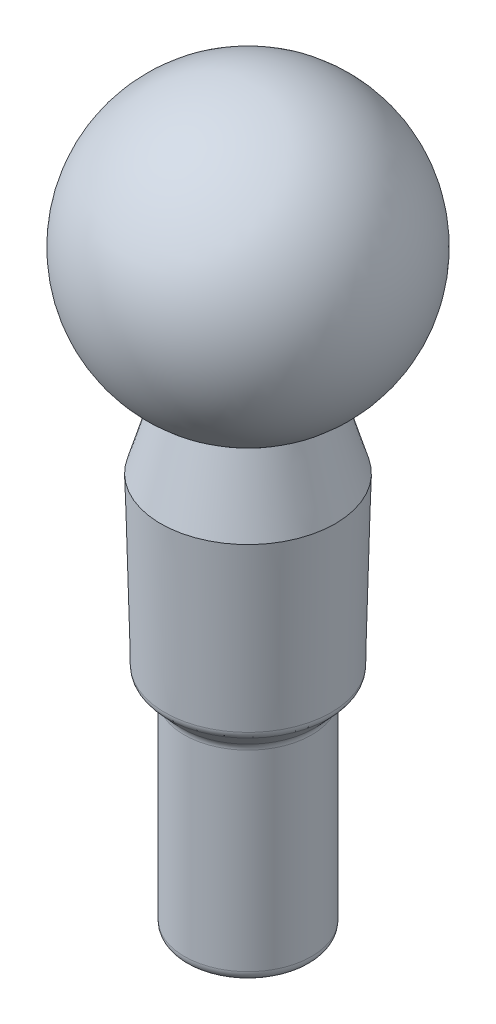
ISO-10303-21;
HEADER;
FILE_DESCRIPTION(('STEP AP214'),'2;1');
FILE_NAME('part.step','',(''),(''),'','','');
FILE_SCHEMA(('AUTOMOTIVE_DESIGN { 1 0 10303 214 1 1 1 1 }'));
ENDSEC;
DATA;
#1=APPLICATION_CONTEXT('core data for automotive mechanical design processes');
#2=APPLICATION_PROTOCOL_DEFINITION('international standard','automotive_design',2000,#1);
#3=PRODUCT_CONTEXT('',#1,'mechanical');
#4=PRODUCT('Part','Part','',(#3));
#5=PRODUCT_RELATED_PRODUCT_CATEGORY('part','',(#4));
#6=PRODUCT_DEFINITION_FORMATION('','',#4);
#7=PRODUCT_DEFINITION_CONTEXT('part definition',#1,'design');
#8=PRODUCT_DEFINITION('design','',#6,#7);
#9=PRODUCT_DEFINITION_SHAPE('','',#8);
#10=(LENGTH_UNIT() NAMED_UNIT(*) SI_UNIT(.MILLI.,.METRE.));
#11=(NAMED_UNIT(*) PLANE_ANGLE_UNIT() SI_UNIT($,.RADIAN.));
#12=(NAMED_UNIT(*) SI_UNIT($,.STERADIAN.) SOLID_ANGLE_UNIT());
#13=UNCERTAINTY_MEASURE_WITH_UNIT(LENGTH_MEASURE(1.E-05),#10,'distance_accuracy_value','');
#14=(GEOMETRIC_REPRESENTATION_CONTEXT(3) GLOBAL_UNCERTAINTY_ASSIGNED_CONTEXT((#13)) GLOBAL_UNIT_ASSIGNED_CONTEXT((#10,
#11,#12)) REPRESENTATION_CONTEXT('',''));
#15=CARTESIAN_POINT('',(0.,0.,0.));
#16=DIRECTION('',(0.,0.,1.));
#17=DIRECTION('',(1.,0.,0.));
#18=AXIS2_PLACEMENT_3D('',#15,#16,#17);
#19=CARTESIAN_POINT('',(0.,0.,0.));
#20=DIRECTION('',(0.,1.,0.));
#21=DIRECTION('',(0.,0.,-1.));
#22=AXIS2_PLACEMENT_3D('',#19,#20,#21);
#23=SPHERICAL_SURFACE('',#22,13.435);
#24=CARTESIAN_POINT('',(0.,-11.8712512409177,0.));
#25=DIRECTION('',(0.,-1.,0.));
#26=DIRECTION('',(1.,0.,0.));
#27=AXIS2_PLACEMENT_3D('',#24,#25,#26);
#28=CIRCLE('',#27,6.29067714757411);
#29=CARTESIAN_POINT('',(6.29067714757411,-11.8712512409177,0.));
#30=VERTEX_POINT('',#29);
#31=EDGE_CURVE('E10',#30,#30,#28,.T.);
#32=ORIENTED_EDGE('',*,*,#31,.F.);
#33=EDGE_LOOP('',(#32));
#34=FACE_BOUND('',#33,.T.);
#35=ADVANCED_FACE('F36',(#34),#23,.T.);
#36=CARTESIAN_POINT('',(0.,-56.,0.));
#37=DIRECTION('',(0.,1.,0.));
#38=DIRECTION('',(1.,0.,0.));
#39=AXIS2_PLACEMENT_3D('',#36,#37,#38);
#40=PLANE('',#39);
#41=CARTESIAN_POINT('',(0.,-56.,0.));
#42=DIRECTION('',(0.,-1.,0.));
#43=DIRECTION('',(1.,0.,0.));
#44=AXIS2_PLACEMENT_3D('',#41,#42,#43);
#45=CIRCLE('',#44,5.);
#46=CARTESIAN_POINT('',(5.00000000000001,-56.,0.));
#47=VERTEX_POINT('',#46);
#48=EDGE_CURVE('E50',#47,#47,#45,.T.);
#49=ORIENTED_EDGE('',*,*,#48,.T.);
#50=EDGE_LOOP('',(#49));
#51=FACE_BOUND('',#50,.T.);
#52=ADVANCED_FACE('F83',(#51),#40,.F.);
#53=CARTESIAN_POINT('',(0.,-55.,0.));
#54=DIRECTION('',(0.,1.,0.));
#55=DIRECTION('',(1.,0.,0.));
#56=AXIS2_PLACEMENT_3D('',#53,#54,#55);
#57=TOROIDAL_SURFACE('',#56,5.,1.);
#58=CARTESIAN_POINT('',(0.,-55.,0.));
#59=DIRECTION('',(0.,-1.,0.));
#60=DIRECTION('',(1.,0.,0.));
#61=AXIS2_PLACEMENT_3D('',#58,#59,#60);
#62=CIRCLE('',#61,6.);
#63=CARTESIAN_POINT('',(6.,-55.,0.));
#64=VERTEX_POINT('',#63);
#65=EDGE_CURVE('E39',#64,#64,#62,.T.);
#66=ORIENTED_EDGE('',*,*,#65,.T.);
#67=EDGE_LOOP('',(#66));
#68=FACE_BOUND('',#67,.T.);
#69=ORIENTED_EDGE('',*,*,#48,.F.);
#70=EDGE_LOOP('',(#69));
#71=FACE_BOUND('',#70,.T.);
#72=ADVANCED_FACE('F79',(#68,#71),#57,.T.);
#73=CARTESIAN_POINT('',(0.,13.435,0.));
#74=DIRECTION('',(0.,1.,0.));
#75=DIRECTION('',(1.,0.,0.));
#76=AXIS2_PLACEMENT_3D('',#73,#74,#75);
#77=CYLINDRICAL_SURFACE('',#76,6.);
#78=ORIENTED_EDGE('',*,*,#65,.F.);
#79=EDGE_LOOP('',(#78));
#80=FACE_BOUND('',#79,.T.);
#81=CARTESIAN_POINT('',(0.,-36.8915819163054,0.));
#82=DIRECTION('',(0.,-1.,0.));
#83=DIRECTION('',(1.,0.,0.));
#84=AXIS2_PLACEMENT_3D('',#81,#82,#83);
#85=CIRCLE('',#84,6.);
#86=CARTESIAN_POINT('',(6.,-36.8915819163054,0.));
#87=VERTEX_POINT('',#86);
#88=EDGE_CURVE('E47',#87,#87,#85,.T.);
#89=ORIENTED_EDGE('',*,*,#88,.T.);
#90=EDGE_LOOP('',(#89));
#91=FACE_BOUND('',#90,.T.);
#92=ADVANCED_FACE('F65',(#80,#91),#77,.T.);
#93=CARTESIAN_POINT('',(0.,-36.8915819163054,0.));
#94=DIRECTION('',(0.,1.,0.));
#95=DIRECTION('',(1.,0.,0.));
#96=AXIS2_PLACEMENT_3D('',#93,#94,#95);
#97=TOROIDAL_SURFACE('',#96,7.,1.);
#98=CARTESIAN_POINT('',(0.,-36.212539934688,0.));
#99=DIRECTION('',(0.,-1.,0.));
#100=DIRECTION('',(1.,0.,0.));
#101=AXIS2_PLACEMENT_3D('',#98,#99,#100);
#102=CIRCLE('',#101,6.26590056041359);
#103=CARTESIAN_POINT('',(6.26590056041359,-36.212539934688,0.));
#104=VERTEX_POINT('',#103);
#105=EDGE_CURVE('E60',#104,#104,#102,.T.);
#106=ORIENTED_EDGE('',*,*,#105,.T.);
#107=EDGE_LOOP('',(#106));
#108=FACE_BOUND('',#107,.T.);
#109=ORIENTED_EDGE('',*,*,#88,.F.);
#110=EDGE_LOOP('',(#109));
#111=FACE_BOUND('',#110,.T.);
#112=ADVANCED_FACE('F67',(#108,#111),#97,.F.);
#113=CARTESIAN_POINT('',(0.,-36.212539934688,0.));
#114=DIRECTION('',(0.,1.,0.));
#115=DIRECTION('',(1.,0.,0.));
#116=AXIS2_PLACEMENT_3D('',#113,#114,#115);
#117=CONICAL_SURFACE('',#116,6.26590056041359,0.746456820300414);
#118=ORIENTED_EDGE('',*,*,#105,.F.);
#119=EDGE_LOOP('',(#118));
#120=FACE_BOUND('',#119,.T.);
#121=CARTESIAN_POINT('',(0.,-34.7771918815399,0.));
#122=DIRECTION('',(0.,-1.,0.));
#123=DIRECTION('',(1.,0.,0.));
#124=AXIS2_PLACEMENT_3D('',#121,#122,#123);
#125=CIRCLE('',#124,7.59359750957557);
#126=CARTESIAN_POINT('',(7.59359750957557,-34.7771918815399,0.));
#127=VERTEX_POINT('',#126);
#128=EDGE_CURVE('E57',#127,#127,#125,.T.);
#129=ORIENTED_EDGE('',*,*,#128,.T.);
#130=EDGE_LOOP('',(#129));
#131=FACE_BOUND('',#130,.T.);
#132=ADVANCED_FACE('F69',(#120,#131),#117,.T.);
#133=CARTESIAN_POINT('',(0.,-34.0981498999225,0.));
#134=DIRECTION('',(0.,1.,0.));
#135=DIRECTION('',(1.,0.,0.));
#136=AXIS2_PLACEMENT_3D('',#133,#134,#135);
#137=TOROIDAL_SURFACE('',#136,6.85949806998917,1.);
#138=CARTESIAN_POINT('',(0.,-34.1225176620587,0.));
#139=DIRECTION('',(0.,-1.,0.));
#140=DIRECTION('',(1.,0.,0.));
#141=AXIS2_PLACEMENT_3D('',#138,#139,#140);
#142=CIRCLE('',#141,7.85920113198732);
#143=CARTESIAN_POINT('',(7.85920113198732,-34.1225176620587,0.));
#144=VERTEX_POINT('',#143);
#145=EDGE_CURVE('E54',#144,#144,#142,.T.);
#146=ORIENTED_EDGE('',*,*,#145,.T.);
#147=EDGE_LOOP('',(#146));
#148=FACE_BOUND('',#147,.T.);
#149=ORIENTED_EDGE('',*,*,#128,.F.);
#150=EDGE_LOOP('',(#149));
#151=FACE_BOUND('',#150,.T.);
#152=ADVANCED_FACE('F76',(#148,#151),#137,.T.);
#153=CARTESIAN_POINT('',(0.,-34.1225176620587,0.));
#154=DIRECTION('',(0.,1.,0.));
#155=DIRECTION('',(1.,0.,0.));
#156=AXIS2_PLACEMENT_3D('',#153,#154,#155);
#157=CONICAL_SURFACE('',#156,7.85920113198732,0.024370174327582);
#158=ORIENTED_EDGE('',*,*,#145,.F.);
#159=EDGE_LOOP('',(#158));
#160=FACE_BOUND('',#159,.T.);
#161=CARTESIAN_POINT('',(0.,-18.5,0.));
#162=DIRECTION('',(0.,-1.,0.));
#163=DIRECTION('',(1.,0.,0.));
#164=AXIS2_PLACEMENT_3D('',#161,#162,#163);
#165=CIRCLE('',#164,8.24);
#166=CARTESIAN_POINT('',(8.24,-18.5,0.));
#167=VERTEX_POINT('',#166);
#168=EDGE_CURVE('E51',#167,#167,#165,.T.);
#169=ORIENTED_EDGE('',*,*,#168,.T.);
#170=EDGE_LOOP('',(#169));
#171=FACE_BOUND('',#170,.T.);
#172=ADVANCED_FACE('F92',(#160,#171),#157,.T.);
#173=CARTESIAN_POINT('',(0.,-11.8712512409177,0.));
#174=DIRECTION('',(0.,-1.,0.));
#175=DIRECTION('',(-1.,0.,0.));
#176=AXIS2_PLACEMENT_3D('',#173,#174,#175);
#177=CONICAL_SURFACE('',#176,6.29067714757411,0.286008518619848);
#178=ORIENTED_EDGE('',*,*,#31,.T.);
#179=EDGE_LOOP('',(#178));
#180=FACE_BOUND('',#179,.T.);
#181=ORIENTED_EDGE('',*,*,#168,.F.);
#182=EDGE_LOOP('',(#181));
#183=FACE_BOUND('',#182,.T.);
#184=ADVANCED_FACE('F85',(#180,#183),#177,.T.);
#185=CLOSED_SHELL('',(#35,#52,#72,#92,#112,#132,#152,#172,#184));
#186=MANIFOLD_SOLID_BREP('B2',#185);
#187=ADVANCED_BREP_SHAPE_REPRESENTATION('',(#18,#186),#14);
#188=SHAPE_DEFINITION_REPRESENTATION(#9,#187);
ENDSEC;
END-ISO-10303-21;
